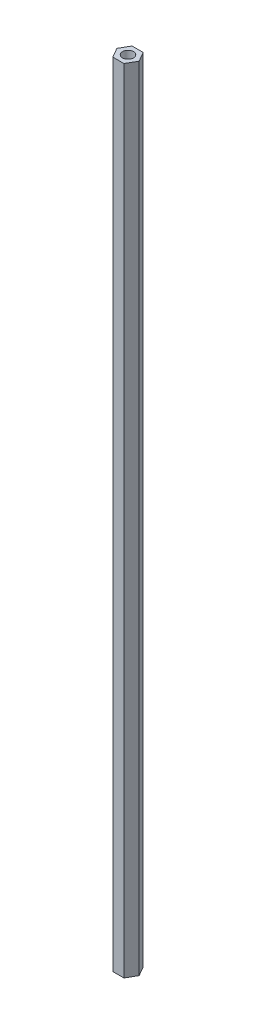
ISO-10303-21;
HEADER;
FILE_DESCRIPTION(('STEP AP214'),'2;1');
FILE_NAME('part.step','',(''),(''),'','','');
FILE_SCHEMA(('AUTOMOTIVE_DESIGN { 1 0 10303 214 1 1 1 1 }'));
ENDSEC;
DATA;
#1=APPLICATION_CONTEXT('core data for automotive mechanical design processes');
#2=APPLICATION_PROTOCOL_DEFINITION('international standard','automotive_design',2000,#1);
#3=PRODUCT_CONTEXT('',#1,'mechanical');
#4=PRODUCT('Part','Part','',(#3));
#5=PRODUCT_RELATED_PRODUCT_CATEGORY('part','',(#4));
#6=PRODUCT_DEFINITION_FORMATION('','',#4);
#7=PRODUCT_DEFINITION_CONTEXT('part definition',#1,'design');
#8=PRODUCT_DEFINITION('design','',#6,#7);
#9=PRODUCT_DEFINITION_SHAPE('','',#8);
#10=(LENGTH_UNIT() NAMED_UNIT(*) SI_UNIT(.MILLI.,.METRE.));
#11=(NAMED_UNIT(*) PLANE_ANGLE_UNIT() SI_UNIT($,.RADIAN.));
#12=(NAMED_UNIT(*) SI_UNIT($,.STERADIAN.) SOLID_ANGLE_UNIT());
#13=UNCERTAINTY_MEASURE_WITH_UNIT(LENGTH_MEASURE(1.E-05),#10,'distance_accuracy_value','');
#14=(GEOMETRIC_REPRESENTATION_CONTEXT(3) GLOBAL_UNCERTAINTY_ASSIGNED_CONTEXT((#13)) GLOBAL_UNIT_ASSIGNED_CONTEXT((#10,
#11,#12)) REPRESENTATION_CONTEXT('',''));
#15=CARTESIAN_POINT('',(0.,0.,0.));
#16=DIRECTION('',(0.,0.,1.));
#17=DIRECTION('',(1.,0.,0.));
#18=AXIS2_PLACEMENT_3D('',#15,#16,#17);
#19=CARTESIAN_POINT('',(0.,288.,0.));
#20=DIRECTION('',(0.,1.,0.));
#21=DIRECTION('',(0.,0.,1.));
#22=AXIS2_PLACEMENT_3D('',#19,#20,#21);
#23=PLANE('',#22);
#24=DIRECTION('',(-0.5,0.,-0.866025403784438));
#25=VECTOR('',#24,1.);
#26=CARTESIAN_POINT('',(4.04145188432738,288.,0.));
#27=LINE('',#26,#25);
#28=CARTESIAN_POINT('',(4.04145188432738,288.,0.));
#29=VERTEX_POINT('',#28);
#30=CARTESIAN_POINT('',(2.02072594216369,288.,-3.5));
#31=VERTEX_POINT('',#30);
#32=EDGE_CURVE('E152',#29,#31,#27,.T.);
#33=ORIENTED_EDGE('',*,*,#32,.T.);
#34=DIRECTION('',(-1.,0.,0.));
#35=VECTOR('',#34,1.);
#36=CARTESIAN_POINT('',(2.02072594216369,288.,-3.5));
#37=LINE('',#36,#35);
#38=CARTESIAN_POINT('',(-2.02072594216369,288.,-3.5));
#39=VERTEX_POINT('',#38);
#40=EDGE_CURVE('E100',#31,#39,#37,.T.);
#41=ORIENTED_EDGE('',*,*,#40,.T.);
#42=DIRECTION('',(-0.5,0.,0.866025403784439));
#43=VECTOR('',#42,1.);
#44=CARTESIAN_POINT('',(-2.02072594216369,288.,-3.5));
#45=LINE('',#44,#43);
#46=CARTESIAN_POINT('',(-4.04145188432738,288.,0.));
#47=VERTEX_POINT('',#46);
#48=EDGE_CURVE('E113',#39,#47,#45,.T.);
#49=ORIENTED_EDGE('',*,*,#48,.T.);
#50=DIRECTION('',(0.5,0.,0.866025403784439));
#51=VECTOR('',#50,1.);
#52=CARTESIAN_POINT('',(-4.04145188432738,288.,0.));
#53=LINE('',#52,#51);
#54=CARTESIAN_POINT('',(-2.02072594216369,288.,3.5));
#55=VERTEX_POINT('',#54);
#56=EDGE_CURVE('E107',#47,#55,#53,.T.);
#57=ORIENTED_EDGE('',*,*,#56,.T.);
#58=DIRECTION('',(1.,0.,0.));
#59=VECTOR('',#58,1.);
#60=CARTESIAN_POINT('',(-2.02072594216369,288.,3.5));
#61=LINE('',#60,#59);
#62=CARTESIAN_POINT('',(2.02072594216369,288.,3.5));
#63=VERTEX_POINT('',#62);
#64=EDGE_CURVE('E111',#55,#63,#61,.T.);
#65=ORIENTED_EDGE('',*,*,#64,.T.);
#66=DIRECTION('',(0.5,0.,-0.866025403784439));
#67=VECTOR('',#66,1.);
#68=CARTESIAN_POINT('',(2.02072594216369,288.,3.5));
#69=LINE('',#68,#67);
#70=EDGE_CURVE('E63',#63,#29,#69,.T.);
#71=ORIENTED_EDGE('',*,*,#70,.T.);
#72=EDGE_LOOP('',(#33,#41,#49,#57,#65,#71));
#73=FACE_BOUND('',#72,.T.);
#74=CARTESIAN_POINT('',(0.,288.,0.));
#75=DIRECTION('',(0.,1.,0.));
#76=DIRECTION('',(0.,0.,1.));
#77=AXIS2_PLACEMENT_3D('',#74,#75,#76);
#78=CIRCLE('',#77,2.);
#79=CARTESIAN_POINT('',(0.,288.,2.));
#80=VERTEX_POINT('',#79);
#81=EDGE_CURVE('E140',#80,#80,#78,.T.);
#82=ORIENTED_EDGE('',*,*,#81,.F.);
#83=EDGE_LOOP('',(#82));
#84=FACE_BOUND('',#83,.T.);
#85=ADVANCED_FACE('F45',(#73,#84),#23,.T.);
#86=CARTESIAN_POINT('',(0.,0.,0.));
#87=DIRECTION('',(0.,1.,0.));
#88=DIRECTION('',(0.,0.,1.));
#89=AXIS2_PLACEMENT_3D('',#86,#87,#88);
#90=PLANE('',#89);
#91=DIRECTION('',(-0.5,0.,-0.866025403784438));
#92=VECTOR('',#91,1.);
#93=CARTESIAN_POINT('',(4.04145188432738,0.,0.));
#94=LINE('',#93,#92);
#95=CARTESIAN_POINT('',(4.04145188432738,0.,0.));
#96=VERTEX_POINT('',#95);
#97=CARTESIAN_POINT('',(2.02072594216369,0.,-3.5));
#98=VERTEX_POINT('',#97);
#99=EDGE_CURVE('E135',#96,#98,#94,.T.);
#100=ORIENTED_EDGE('',*,*,#99,.F.);
#101=DIRECTION('',(0.5,0.,-0.866025403784439));
#102=VECTOR('',#101,1.);
#103=CARTESIAN_POINT('',(2.02072594216369,0.,3.5));
#104=LINE('',#103,#102);
#105=CARTESIAN_POINT('',(2.02072594216369,0.,3.5));
#106=VERTEX_POINT('',#105);
#107=EDGE_CURVE('E92',#106,#96,#104,.T.);
#108=ORIENTED_EDGE('',*,*,#107,.F.);
#109=DIRECTION('',(1.,0.,0.));
#110=VECTOR('',#109,1.);
#111=CARTESIAN_POINT('',(-2.02072594216369,0.,3.5));
#112=LINE('',#111,#110);
#113=CARTESIAN_POINT('',(-2.02072594216369,0.,3.5));
#114=VERTEX_POINT('',#113);
#115=EDGE_CURVE('E86',#114,#106,#112,.T.);
#116=ORIENTED_EDGE('',*,*,#115,.F.);
#117=DIRECTION('',(0.5,0.,0.866025403784439));
#118=VECTOR('',#117,1.);
#119=CARTESIAN_POINT('',(-4.04145188432738,0.,0.));
#120=LINE('',#119,#118);
#121=CARTESIAN_POINT('',(-4.04145188432738,0.,0.));
#122=VERTEX_POINT('',#121);
#123=EDGE_CURVE('E122',#122,#114,#120,.T.);
#124=ORIENTED_EDGE('',*,*,#123,.F.);
#125=DIRECTION('',(-0.5,0.,0.866025403784439));
#126=VECTOR('',#125,1.);
#127=CARTESIAN_POINT('',(-2.02072594216369,0.,-3.5));
#128=LINE('',#127,#126);
#129=CARTESIAN_POINT('',(-2.02072594216369,0.,-3.5));
#130=VERTEX_POINT('',#129);
#131=EDGE_CURVE('E143',#130,#122,#128,.T.);
#132=ORIENTED_EDGE('',*,*,#131,.F.);
#133=DIRECTION('',(-1.,0.,0.));
#134=VECTOR('',#133,1.);
#135=CARTESIAN_POINT('',(2.02072594216369,0.,-3.5));
#136=LINE('',#135,#134);
#137=EDGE_CURVE('E139',#98,#130,#136,.T.);
#138=ORIENTED_EDGE('',*,*,#137,.F.);
#139=EDGE_LOOP('',(#100,#108,#116,#124,#132,#138));
#140=FACE_BOUND('',#139,.T.);
#141=CARTESIAN_POINT('',(0.,0.,0.));
#142=DIRECTION('',(0.,1.,0.));
#143=DIRECTION('',(0.,0.,1.));
#144=AXIS2_PLACEMENT_3D('',#141,#142,#143);
#145=CIRCLE('',#144,2.);
#146=CARTESIAN_POINT('',(0.,0.,2.));
#147=VERTEX_POINT('',#146);
#148=EDGE_CURVE('E249',#147,#147,#145,.T.);
#149=ORIENTED_EDGE('',*,*,#148,.T.);
#150=EDGE_LOOP('',(#149));
#151=FACE_BOUND('',#150,.T.);
#152=ADVANCED_FACE('F165',(#140,#151),#90,.F.);
#153=CARTESIAN_POINT('',(4.04145188432738,288.,0.));
#154=DIRECTION('',(-0.866025403784438,0.,0.5));
#155=DIRECTION('',(0.5,0.,0.866025403784439));
#156=AXIS2_PLACEMENT_3D('',#153,#154,#155);
#157=PLANE('',#156);
#158=ORIENTED_EDGE('',*,*,#99,.T.);
#159=DIRECTION('',(0.,-1.,0.));
#160=VECTOR('',#159,1.);
#161=CARTESIAN_POINT('',(2.02072594216369,288.,-3.5));
#162=LINE('',#161,#160);
#163=EDGE_CURVE('E11',#31,#98,#162,.T.);
#164=ORIENTED_EDGE('',*,*,#163,.F.);
#165=ORIENTED_EDGE('',*,*,#32,.F.);
#166=DIRECTION('',(0.,-1.,0.));
#167=VECTOR('',#166,1.);
#168=CARTESIAN_POINT('',(4.04145188432738,288.,0.));
#169=LINE('',#168,#167);
#170=EDGE_CURVE('E131',#29,#96,#169,.T.);
#171=ORIENTED_EDGE('',*,*,#170,.T.);
#172=EDGE_LOOP('',(#158,#164,#165,#171));
#173=FACE_BOUND('',#172,.T.);
#174=ADVANCED_FACE('F47',(#173),#157,.F.);
#175=CARTESIAN_POINT('',(2.02072594216369,288.,-3.5));
#176=DIRECTION('',(0.,0.,1.));
#177=DIRECTION('',(1.,0.,0.));
#178=AXIS2_PLACEMENT_3D('',#175,#176,#177);
#179=PLANE('',#178);
#180=ORIENTED_EDGE('',*,*,#137,.T.);
#181=DIRECTION('',(0.,-1.,0.));
#182=VECTOR('',#181,1.);
#183=CARTESIAN_POINT('',(-2.02072594216369,288.,-3.5));
#184=LINE('',#183,#182);
#185=EDGE_CURVE('E55',#39,#130,#184,.T.);
#186=ORIENTED_EDGE('',*,*,#185,.F.);
#187=ORIENTED_EDGE('',*,*,#40,.F.);
#188=ORIENTED_EDGE('',*,*,#163,.T.);
#189=EDGE_LOOP('',(#180,#186,#187,#188));
#190=FACE_BOUND('',#189,.T.);
#191=ADVANCED_FACE('F190',(#190),#179,.F.);
#192=CARTESIAN_POINT('',(-2.02072594216369,288.,-3.5));
#193=DIRECTION('',(0.866025403784439,0.,0.5));
#194=DIRECTION('',(0.5,0.,-0.866025403784439));
#195=AXIS2_PLACEMENT_3D('',#192,#193,#194);
#196=PLANE('',#195);
#197=ORIENTED_EDGE('',*,*,#131,.T.);
#198=DIRECTION('',(0.,-1.,0.));
#199=VECTOR('',#198,1.);
#200=CARTESIAN_POINT('',(-4.04145188432738,288.,0.));
#201=LINE('',#200,#199);
#202=EDGE_CURVE('E124',#47,#122,#201,.T.);
#203=ORIENTED_EDGE('',*,*,#202,.F.);
#204=ORIENTED_EDGE('',*,*,#48,.F.);
#205=ORIENTED_EDGE('',*,*,#185,.T.);
#206=EDGE_LOOP('',(#197,#203,#204,#205));
#207=FACE_BOUND('',#206,.T.);
#208=ADVANCED_FACE('F162',(#207),#196,.F.);
#209=CARTESIAN_POINT('',(-4.04145188432738,288.,0.));
#210=DIRECTION('',(0.866025403784438,0.,-0.5));
#211=DIRECTION('',(-0.5,0.,-0.866025403784439));
#212=AXIS2_PLACEMENT_3D('',#209,#210,#211);
#213=PLANE('',#212);
#214=ORIENTED_EDGE('',*,*,#123,.T.);
#215=DIRECTION('',(0.,-1.,0.));
#216=VECTOR('',#215,1.);
#217=CARTESIAN_POINT('',(-2.02072594216369,288.,3.5));
#218=LINE('',#217,#216);
#219=EDGE_CURVE('E119',#55,#114,#218,.T.);
#220=ORIENTED_EDGE('',*,*,#219,.F.);
#221=ORIENTED_EDGE('',*,*,#56,.F.);
#222=ORIENTED_EDGE('',*,*,#202,.T.);
#223=EDGE_LOOP('',(#214,#220,#221,#222));
#224=FACE_BOUND('',#223,.T.);
#225=ADVANCED_FACE('F120',(#224),#213,.F.);
#226=CARTESIAN_POINT('',(-2.02072594216369,288.,3.5));
#227=DIRECTION('',(0.,0.,-1.));
#228=DIRECTION('',(-1.,0.,0.));
#229=AXIS2_PLACEMENT_3D('',#226,#227,#228);
#230=PLANE('',#229);
#231=ORIENTED_EDGE('',*,*,#115,.T.);
#232=DIRECTION('',(0.,-1.,0.));
#233=VECTOR('',#232,1.);
#234=CARTESIAN_POINT('',(2.02072594216369,288.,3.5));
#235=LINE('',#234,#233);
#236=EDGE_CURVE('E125',#63,#106,#235,.T.);
#237=ORIENTED_EDGE('',*,*,#236,.F.);
#238=ORIENTED_EDGE('',*,*,#64,.F.);
#239=ORIENTED_EDGE('',*,*,#219,.T.);
#240=EDGE_LOOP('',(#231,#237,#238,#239));
#241=FACE_BOUND('',#240,.T.);
#242=ADVANCED_FACE('F127',(#241),#230,.F.);
#243=CARTESIAN_POINT('',(2.02072594216369,288.,3.5));
#244=DIRECTION('',(-0.866025403784439,0.,-0.5));
#245=DIRECTION('',(-0.5,0.,0.866025403784439));
#246=AXIS2_PLACEMENT_3D('',#243,#244,#245);
#247=PLANE('',#246);
#248=ORIENTED_EDGE('',*,*,#107,.T.);
#249=ORIENTED_EDGE('',*,*,#170,.F.);
#250=ORIENTED_EDGE('',*,*,#70,.F.);
#251=ORIENTED_EDGE('',*,*,#236,.T.);
#252=EDGE_LOOP('',(#248,#249,#250,#251));
#253=FACE_BOUND('',#252,.T.);
#254=ADVANCED_FACE('F170',(#253),#247,.F.);
#255=CARTESIAN_POINT('',(0.,288.,0.));
#256=DIRECTION('',(0.,-1.,0.));
#257=DIRECTION('',(0.,0.,-1.));
#258=AXIS2_PLACEMENT_3D('',#255,#256,#257);
#259=CYLINDRICAL_SURFACE('',#258,2.);
#260=ORIENTED_EDGE('',*,*,#81,.T.);
#261=EDGE_LOOP('',(#260));
#262=FACE_BOUND('',#261,.T.);
#263=ORIENTED_EDGE('',*,*,#148,.F.);
#264=EDGE_LOOP('',(#263));
#265=FACE_BOUND('',#264,.T.);
#266=ADVANCED_FACE('F172',(#262,#265),#259,.F.);
#267=CLOSED_SHELL('',(#85,#152,#174,#191,#208,#225,#242,#254,#266));
#268=MANIFOLD_SOLID_BREP('B2',#267);
#269=ADVANCED_BREP_SHAPE_REPRESENTATION('',(#18,#268),#14);
#270=SHAPE_DEFINITION_REPRESENTATION(#9,#269);
ENDSEC;
END-ISO-10303-21;
